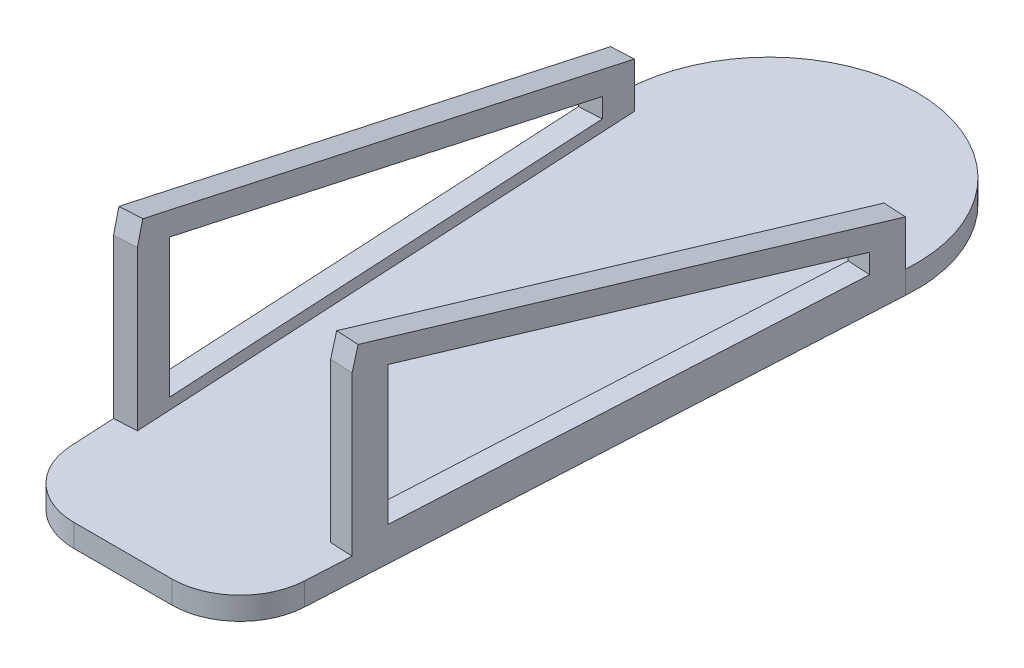
ISO-10303-21;
HEADER;
FILE_DESCRIPTION(('STEP AP214'),'2;1');
FILE_NAME('part.step','',(''),(''),'','','');
FILE_SCHEMA(('AUTOMOTIVE_DESIGN { 1 0 10303 214 1 1 1 1 }'));
ENDSEC;
DATA;
#1=APPLICATION_CONTEXT('core data for automotive mechanical design processes');
#2=APPLICATION_PROTOCOL_DEFINITION('international standard','automotive_design',2000,#1);
#3=PRODUCT_CONTEXT('',#1,'mechanical');
#4=PRODUCT('Part','Part','',(#3));
#5=PRODUCT_RELATED_PRODUCT_CATEGORY('part','',(#4));
#6=PRODUCT_DEFINITION_FORMATION('','',#4);
#7=PRODUCT_DEFINITION_CONTEXT('part definition',#1,'design');
#8=PRODUCT_DEFINITION('design','',#6,#7);
#9=PRODUCT_DEFINITION_SHAPE('','',#8);
#10=(LENGTH_UNIT() NAMED_UNIT(*) SI_UNIT(.MILLI.,.METRE.));
#11=(NAMED_UNIT(*) PLANE_ANGLE_UNIT() SI_UNIT($,.RADIAN.));
#12=(NAMED_UNIT(*) SI_UNIT($,.STERADIAN.) SOLID_ANGLE_UNIT());
#13=UNCERTAINTY_MEASURE_WITH_UNIT(LENGTH_MEASURE(1.E-05),#10,'distance_accuracy_value','');
#14=(GEOMETRIC_REPRESENTATION_CONTEXT(3) GLOBAL_UNCERTAINTY_ASSIGNED_CONTEXT((#13)) GLOBAL_UNIT_ASSIGNED_CONTEXT((#10,
#11,#12)) REPRESENTATION_CONTEXT('',''));
#15=CARTESIAN_POINT('',(0.,0.,0.));
#16=DIRECTION('',(0.,0.,1.));
#17=DIRECTION('',(1.,0.,0.));
#18=AXIS2_PLACEMENT_3D('',#15,#16,#17);
#19=CARTESIAN_POINT('',(0.,10.,-134.821428571429));
#20=DIRECTION('',(0.,-1.,0.));
#21=DIRECTION('',(0.,0.,-1.));
#22=AXIS2_PLACEMENT_3D('',#19,#20,#21);
#23=PLANE('',#22);
#24=DIRECTION('',(-0.998568132270089,0.,0.0534947213716119));
#25=VECTOR('',#24,1.);
#26=CARTESIAN_POINT('',(-42.6076802234846,10.,101.055637257489));
#27=LINE('',#26,#25);
#28=CARTESIAN_POINT('',(-42.6076802234846,10.,101.055637257489));
#29=VERTEX_POINT('',#28);
#30=CARTESIAN_POINT('',(-52.5933615461855,10.,101.590584471205));
#31=VERTEX_POINT('',#30);
#32=EDGE_CURVE('E251',#29,#31,#27,.T.);
#33=ORIENTED_EDGE('',*,*,#32,.T.);
#34=DIRECTION('',(0.0534947213716119,0.,0.998568132270089));
#35=VECTOR('',#34,1.);
#36=CARTESIAN_POINT('',(-65.,10.,-130.));
#37=LINE('',#36,#35);
#38=CARTESIAN_POINT('',(-51.5211691977956,10.,121.604841641148));
#39=VERTEX_POINT('',#38);
#40=EDGE_CURVE('E335',#31,#39,#37,.T.);
#41=ORIENTED_EDGE('',*,*,#40,.T.);
#42=CARTESIAN_POINT('',(-21.5641252296929,10.,120.));
#43=DIRECTION('',(0.,1.,0.));
#44=DIRECTION('',(0.,0.,1.));
#45=AXIS2_PLACEMENT_3D('',#42,#43,#44);
#46=CIRCLE('',#45,30.);
#47=CARTESIAN_POINT('',(-21.5641252296929,10.,150.));
#48=VERTEX_POINT('',#47);
#49=EDGE_CURVE('E338',#39,#48,#46,.T.);
#50=ORIENTED_EDGE('',*,*,#49,.T.);
#51=DIRECTION('',(1.,0.,0.));
#52=VECTOR('',#51,1.);
#53=CARTESIAN_POINT('',(-21.5641252296927,10.,150.));
#54=LINE('',#53,#52);
#55=CARTESIAN_POINT('',(21.5641252296928,10.,150.));
#56=VERTEX_POINT('',#55);
#57=EDGE_CURVE('E340',#48,#56,#54,.T.);
#58=ORIENTED_EDGE('',*,*,#57,.T.);
#59=CARTESIAN_POINT('',(21.564125229693,10.,120.));
#60=DIRECTION('',(0.,1.,0.));
#61=DIRECTION('',(0.,0.,1.));
#62=AXIS2_PLACEMENT_3D('',#59,#60,#61);
#63=CIRCLE('',#62,30.);
#64=CARTESIAN_POINT('',(51.5211691977957,10.,121.604841641148));
#65=VERTEX_POINT('',#64);
#66=EDGE_CURVE('E342',#56,#65,#63,.T.);
#67=ORIENTED_EDGE('',*,*,#66,.T.);
#68=DIRECTION('',(0.0534947213716119,0.,-0.998568132270089));
#69=VECTOR('',#68,1.);
#70=CARTESIAN_POINT('',(51.5211691977957,10.,121.604841641148));
#71=LINE('',#70,#69);
#72=CARTESIAN_POINT('',(52.5933615461855,10.,101.590584471205));
#73=VERTEX_POINT('',#72);
#74=EDGE_CURVE('E344',#65,#73,#71,.T.);
#75=ORIENTED_EDGE('',*,*,#74,.T.);
#76=DIRECTION('',(0.998568132270089,0.,0.0534947213716119));
#77=VECTOR('',#76,1.);
#78=CARTESIAN_POINT('',(42.6076802234846,10.,101.055637257489));
#79=LINE('',#78,#77);
#80=CARTESIAN_POINT('',(42.6076802234846,10.,101.055637257489));
#81=VERTEX_POINT('',#80);
#82=EDGE_CURVE('E311',#81,#73,#79,.T.);
#83=ORIENTED_EDGE('',*,*,#82,.F.);
#84=DIRECTION('',(0.0534947213716118,0.,-0.998568132270089));
#85=VECTOR('',#84,1.);
#86=CARTESIAN_POINT('',(55.0143186772991,10.,-130.534947213716));
#87=LINE('',#86,#85);
#88=CARTESIAN_POINT('',(55.0143186772991,10.,-130.534947213716));
#89=VERTEX_POINT('',#88);
#90=EDGE_CURVE('E298',#81,#89,#87,.T.);
#91=ORIENTED_EDGE('',*,*,#90,.T.);
#92=DIRECTION('',(0.998568132270089,0.,0.0534947213716119));
#93=VECTOR('',#92,1.);
#94=CARTESIAN_POINT('',(55.0143186772991,10.,-130.534947213716));
#95=LINE('',#94,#93);
#96=CARTESIAN_POINT('',(65.,10.,-130.));
#97=VERTEX_POINT('',#96);
#98=EDGE_CURVE('E329',#89,#97,#95,.T.);
#99=ORIENTED_EDGE('',*,*,#98,.T.);
#100=CARTESIAN_POINT('',(0.,10.,-134.821428571429));
#101=DIRECTION('',(0.,1.,0.));
#102=DIRECTION('',(0.,0.,-1.));
#103=AXIS2_PLACEMENT_3D('',#100,#101,#102);
#104=CIRCLE('',#103,65.1785714285714);
#105=CARTESIAN_POINT('',(-65.,10.,-130.));
#106=VERTEX_POINT('',#105);
#107=EDGE_CURVE('E333',#97,#106,#104,.T.);
#108=ORIENTED_EDGE('',*,*,#107,.T.);
#109=DIRECTION('',(-0.998568132270089,0.,0.0534947213716119));
#110=VECTOR('',#109,1.);
#111=CARTESIAN_POINT('',(-55.0143186772991,10.,-130.534947213716));
#112=LINE('',#111,#110);
#113=CARTESIAN_POINT('',(-55.0143186772991,10.,-130.534947213716));
#114=VERTEX_POINT('',#113);
#115=EDGE_CURVE('E56',#114,#106,#112,.T.);
#116=ORIENTED_EDGE('',*,*,#115,.F.);
#117=DIRECTION('',(-0.0534947213716118,0.,-0.998568132270089));
#118=VECTOR('',#117,1.);
#119=CARTESIAN_POINT('',(-55.0143186772991,10.,-130.534947213716));
#120=LINE('',#119,#118);
#121=EDGE_CURVE('E51',#29,#114,#120,.T.);
#122=ORIENTED_EDGE('',*,*,#121,.F.);
#123=EDGE_LOOP('',(#33,#41,#50,#58,#67,#75,#83,#91,#99,#108,#116,#122));
#124=FACE_BOUND('',#123,.T.);
#125=ADVANCED_FACE('F36',(#124),#23,.F.);
#126=CARTESIAN_POINT('',(0.,10.,-134.821428571429));
#127=DIRECTION('',(0.,-1.,0.));
#128=DIRECTION('',(0.,0.,-1.));
#129=AXIS2_PLACEMENT_3D('',#126,#127,#128);
#130=CYLINDRICAL_SURFACE('',#129,65.1785714285714);
#131=CARTESIAN_POINT('',(0.,0.,-134.821428571429));
#132=DIRECTION('',(0.,1.,0.));
#133=DIRECTION('',(0.,0.,-1.));
#134=AXIS2_PLACEMENT_3D('',#131,#132,#133);
#135=CIRCLE('',#134,65.1785714285714);
#136=CARTESIAN_POINT('',(65.,0.,-130.));
#137=VERTEX_POINT('',#136);
#138=CARTESIAN_POINT('',(-65.,0.,-130.));
#139=VERTEX_POINT('',#138);
#140=EDGE_CURVE('E324',#137,#139,#135,.T.);
#141=ORIENTED_EDGE('',*,*,#140,.T.);
#142=DIRECTION('',(0.,-1.,0.));
#143=VECTOR('',#142,1.);
#144=CARTESIAN_POINT('',(-65.,10.,-130.));
#145=LINE('',#144,#143);
#146=EDGE_CURVE('E11',#106,#139,#145,.T.);
#147=ORIENTED_EDGE('',*,*,#146,.F.);
#148=ORIENTED_EDGE('',*,*,#107,.F.);
#149=DIRECTION('',(0.,-1.,0.));
#150=VECTOR('',#149,1.);
#151=CARTESIAN_POINT('',(65.,10.,-130.));
#152=LINE('',#151,#150);
#153=EDGE_CURVE('E347',#97,#137,#152,.T.);
#154=ORIENTED_EDGE('',*,*,#153,.T.);
#155=EDGE_LOOP('',(#141,#147,#148,#154));
#156=FACE_BOUND('',#155,.T.);
#157=ADVANCED_FACE('F38',(#156),#130,.T.);
#158=CARTESIAN_POINT('',(-65.,10.,-130.));
#159=DIRECTION('',(0.998568132270089,0.,-0.0534947213716119));
#160=DIRECTION('',(-0.0534947213716119,0.,-0.998568132270089));
#161=AXIS2_PLACEMENT_3D('',#158,#159,#160);
#162=PLANE('',#161);
#163=DIRECTION('',(0.0534947213716119,0.,0.998568132270089));
#164=VECTOR('',#163,1.);
#165=CARTESIAN_POINT('',(-65.,0.,-130.));
#166=LINE('',#165,#164);
#167=CARTESIAN_POINT('',(-51.5211691977956,0.,121.604841641148));
#168=VERTEX_POINT('',#167);
#169=EDGE_CURVE('E350',#139,#168,#166,.T.);
#170=ORIENTED_EDGE('',*,*,#169,.T.);
#171=DIRECTION('',(0.,-1.,0.));
#172=VECTOR('',#171,1.);
#173=CARTESIAN_POINT('',(-51.5211691977956,10.,121.604841641148));
#174=LINE('',#173,#172);
#175=EDGE_CURVE('E44',#39,#168,#174,.T.);
#176=ORIENTED_EDGE('',*,*,#175,.F.);
#177=ORIENTED_EDGE('',*,*,#40,.F.);
#178=DIRECTION('',(0.,-1.,0.));
#179=VECTOR('',#178,1.);
#180=CARTESIAN_POINT('',(-52.5933615461855,10.,101.590584471205));
#181=LINE('',#180,#179);
#182=CARTESIAN_POINT('',(-52.5933615461855,80.,101.590584471205));
#183=VERTEX_POINT('',#182);
#184=EDGE_CURVE('E229',#183,#31,#181,.T.);
#185=ORIENTED_EDGE('',*,*,#184,.F.);
#186=DIRECTION('',(0.0134679695925024,-0.967789025760913,0.251402099060048));
#187=VECTOR('',#186,1.);
#188=CARTESIAN_POINT('',(-52.5933615461855,80.,101.590584471205));
#189=LINE('',#188,#187);
#190=CARTESIAN_POINT('',(-52.7280412421105,89.6778902576091,99.0765634806047));
#191=VERTEX_POINT('',#190);
#192=EDGE_CURVE('E246',#191,#183,#189,.T.);
#193=ORIENTED_EDGE('',*,*,#192,.F.);
#194=DIRECTION('',(0.0517716042795837,0.251762589787965,0.966403279885564));
#195=VECTOR('',#194,1.);
#196=CARTESIAN_POINT('',(-52.7280412421105,89.6778902576091,99.0765634806047));
#197=LINE('',#196,#195);
#198=CARTESIAN_POINT('',(-65.,30.,-130.));
#199=VERTEX_POINT('',#198);
#200=EDGE_CURVE('E248',#199,#191,#197,.T.);
#201=ORIENTED_EDGE('',*,*,#200,.F.);
#202=DIRECTION('',(0.,1.,0.));
#203=VECTOR('',#202,1.);
#204=CARTESIAN_POINT('',(-65.,30.,-130.));
#205=LINE('',#204,#203);
#206=EDGE_CURVE('E236',#106,#199,#205,.T.);
#207=ORIENTED_EDGE('',*,*,#206,.F.);
#208=ORIENTED_EDGE('',*,*,#146,.T.);
#209=EDGE_LOOP('',(#170,#176,#177,#185,#193,#201,#207,#208));
#210=FACE_BOUND('',#209,.T.);
#211=DIRECTION('',(0.0517716042795837,0.251762589787965,0.966403279885564));
#212=VECTOR('',#211,1.);
#213=CARTESIAN_POINT('',(-53.3957823667597,76.0978697357616,86.6120624871538));
#214=LINE('',#213,#212);
#215=CARTESIAN_POINT('',(-64.1975791794259,23.5692997259528,-115.021478015949));
#216=VERTEX_POINT('',#215);
#217=CARTESIAN_POINT('',(-53.3957823667597,76.0978697357616,86.6120624871538));
#218=VERTEX_POINT('',#217);
#219=EDGE_CURVE('E223',#216,#218,#214,.T.);
#220=ORIENTED_EDGE('',*,*,#219,.T.);
#221=DIRECTION('',(0.,-1.,0.));
#222=VECTOR('',#221,1.);
#223=CARTESIAN_POINT('',(-53.3957823667597,15.,86.6120624871538));
#224=LINE('',#223,#222);
#225=CARTESIAN_POINT('',(-53.3957823667597,15.,86.6120624871538));
#226=VERTEX_POINT('',#225);
#227=EDGE_CURVE('E209',#218,#226,#224,.T.);
#228=ORIENTED_EDGE('',*,*,#227,.T.);
#229=DIRECTION('',(-0.0534947213716119,0.,-0.998568132270089));
#230=VECTOR('',#229,1.);
#231=CARTESIAN_POINT('',(-64.1975791794259,15.,-115.021478015949));
#232=LINE('',#231,#230);
#233=CARTESIAN_POINT('',(-64.1975791794259,15.,-115.021478015949));
#234=VERTEX_POINT('',#233);
#235=EDGE_CURVE('E214',#226,#234,#232,.T.);
#236=ORIENTED_EDGE('',*,*,#235,.T.);
#237=DIRECTION('',(0.,1.,0.));
#238=VECTOR('',#237,1.);
#239=CARTESIAN_POINT('',(-64.1975791794259,23.5692997259528,-115.021478015949));
#240=LINE('',#239,#238);
#241=EDGE_CURVE('E217',#234,#216,#240,.T.);
#242=ORIENTED_EDGE('',*,*,#241,.T.);
#243=EDGE_LOOP('',(#220,#228,#236,#242));
#244=FACE_BOUND('',#243,.T.);
#245=ADVANCED_FACE('F395',(#210,#244),#162,.F.);
#246=CARTESIAN_POINT('',(-21.5641252296929,10.,120.));
#247=DIRECTION('',(0.,-1.,0.));
#248=DIRECTION('',(0.,0.,-1.));
#249=AXIS2_PLACEMENT_3D('',#246,#247,#248);
#250=CYLINDRICAL_SURFACE('',#249,30.);
#251=CARTESIAN_POINT('',(-21.5641252296929,0.,120.));
#252=DIRECTION('',(0.,1.,0.));
#253=DIRECTION('',(0.,0.,1.));
#254=AXIS2_PLACEMENT_3D('',#251,#252,#253);
#255=CIRCLE('',#254,30.);
#256=CARTESIAN_POINT('',(-21.5641252296929,0.,150.));
#257=VERTEX_POINT('',#256);
#258=EDGE_CURVE('E352',#168,#257,#255,.T.);
#259=ORIENTED_EDGE('',*,*,#258,.T.);
#260=DIRECTION('',(0.,-1.,0.));
#261=VECTOR('',#260,1.);
#262=CARTESIAN_POINT('',(-21.5641252296929,10.,150.));
#263=LINE('',#262,#261);
#264=EDGE_CURVE('E367',#48,#257,#263,.T.);
#265=ORIENTED_EDGE('',*,*,#264,.F.);
#266=ORIENTED_EDGE('',*,*,#49,.F.);
#267=ORIENTED_EDGE('',*,*,#175,.T.);
#268=EDGE_LOOP('',(#259,#265,#266,#267));
#269=FACE_BOUND('',#268,.T.);
#270=ADVANCED_FACE('F374',(#269),#250,.T.);
#271=CARTESIAN_POINT('',(-21.5641252296927,10.,150.));
#272=DIRECTION('',(0.,0.,-1.));
#273=DIRECTION('',(-1.,0.,0.));
#274=AXIS2_PLACEMENT_3D('',#271,#272,#273);
#275=PLANE('',#274);
#276=DIRECTION('',(1.,0.,0.));
#277=VECTOR('',#276,1.);
#278=CARTESIAN_POINT('',(-21.5641252296927,0.,150.));
#279=LINE('',#278,#277);
#280=CARTESIAN_POINT('',(21.5641252296928,0.,150.));
#281=VERTEX_POINT('',#280);
#282=EDGE_CURVE('E354',#257,#281,#279,.T.);
#283=ORIENTED_EDGE('',*,*,#282,.T.);
#284=DIRECTION('',(0.,-1.,0.));
#285=VECTOR('',#284,1.);
#286=CARTESIAN_POINT('',(21.5641252296928,10.,150.));
#287=LINE('',#286,#285);
#288=EDGE_CURVE('E364',#56,#281,#287,.T.);
#289=ORIENTED_EDGE('',*,*,#288,.F.);
#290=ORIENTED_EDGE('',*,*,#57,.F.);
#291=ORIENTED_EDGE('',*,*,#264,.T.);
#292=EDGE_LOOP('',(#283,#289,#290,#291));
#293=FACE_BOUND('',#292,.T.);
#294=ADVANCED_FACE('F385',(#293),#275,.F.);
#295=CARTESIAN_POINT('',(21.564125229693,10.,120.));
#296=DIRECTION('',(0.,-1.,0.));
#297=DIRECTION('',(0.,0.,-1.));
#298=AXIS2_PLACEMENT_3D('',#295,#296,#297);
#299=CYLINDRICAL_SURFACE('',#298,30.);
#300=CARTESIAN_POINT('',(21.564125229693,0.,120.));
#301=DIRECTION('',(0.,1.,0.));
#302=DIRECTION('',(0.,0.,1.));
#303=AXIS2_PLACEMENT_3D('',#300,#301,#302);
#304=CIRCLE('',#303,30.);
#305=CARTESIAN_POINT('',(51.5211691977957,0.,121.604841641148));
#306=VERTEX_POINT('',#305);
#307=EDGE_CURVE('E356',#281,#306,#304,.T.);
#308=ORIENTED_EDGE('',*,*,#307,.T.);
#309=DIRECTION('',(0.,-1.,0.));
#310=VECTOR('',#309,1.);
#311=CARTESIAN_POINT('',(51.5211691977957,10.,121.604841641148));
#312=LINE('',#311,#310);
#313=EDGE_CURVE('E361',#65,#306,#312,.T.);
#314=ORIENTED_EDGE('',*,*,#313,.F.);
#315=ORIENTED_EDGE('',*,*,#66,.F.);
#316=ORIENTED_EDGE('',*,*,#288,.T.);
#317=EDGE_LOOP('',(#308,#314,#315,#316));
#318=FACE_BOUND('',#317,.T.);
#319=ADVANCED_FACE('F389',(#318),#299,.T.);
#320=CARTESIAN_POINT('',(51.5211691977957,10.,121.604841641148));
#321=DIRECTION('',(-0.998568132270089,0.,-0.0534947213716119));
#322=DIRECTION('',(-0.0534947213716119,0.,0.998568132270089));
#323=AXIS2_PLACEMENT_3D('',#320,#321,#322);
#324=PLANE('',#323);
#325=DIRECTION('',(0.0534947213716119,0.,-0.998568132270089));
#326=VECTOR('',#325,1.);
#327=CARTESIAN_POINT('',(51.5211691977957,0.,121.604841641148));
#328=LINE('',#327,#326);
#329=EDGE_CURVE('E336',#306,#137,#328,.T.);
#330=ORIENTED_EDGE('',*,*,#329,.T.);
#331=ORIENTED_EDGE('',*,*,#153,.F.);
#332=DIRECTION('',(0.,1.,0.));
#333=VECTOR('',#332,1.);
#334=CARTESIAN_POINT('',(65.,30.,-130.));
#335=LINE('',#334,#333);
#336=CARTESIAN_POINT('',(65.,30.,-130.));
#337=VERTEX_POINT('',#336);
#338=EDGE_CURVE('E314',#97,#337,#335,.T.);
#339=ORIENTED_EDGE('',*,*,#338,.T.);
#340=DIRECTION('',(-0.0517716042795837,0.251762589787965,0.966403279885564));
#341=VECTOR('',#340,1.);
#342=CARTESIAN_POINT('',(52.7280412421105,89.6778902576091,99.0765634806047));
#343=LINE('',#342,#341);
#344=CARTESIAN_POINT('',(52.7280412421105,89.6778902576091,99.0765634806047));
#345=VERTEX_POINT('',#344);
#346=EDGE_CURVE('E317',#337,#345,#343,.T.);
#347=ORIENTED_EDGE('',*,*,#346,.T.);
#348=DIRECTION('',(-0.0134679695925024,-0.967789025760913,0.251402099060048));
#349=VECTOR('',#348,1.);
#350=CARTESIAN_POINT('',(52.5933615461855,80.,101.590584471205));
#351=LINE('',#350,#349);
#352=CARTESIAN_POINT('',(52.5933615461855,80.,101.590584471205));
#353=VERTEX_POINT('',#352);
#354=EDGE_CURVE('E299',#345,#353,#351,.T.);
#355=ORIENTED_EDGE('',*,*,#354,.T.);
#356=DIRECTION('',(0.,-1.,0.));
#357=VECTOR('',#356,1.);
#358=CARTESIAN_POINT('',(52.5933615461855,10.,101.590584471205));
#359=LINE('',#358,#357);
#360=EDGE_CURVE('E288',#353,#73,#359,.T.);
#361=ORIENTED_EDGE('',*,*,#360,.T.);
#362=ORIENTED_EDGE('',*,*,#74,.F.);
#363=ORIENTED_EDGE('',*,*,#313,.T.);
#364=EDGE_LOOP('',(#330,#331,#339,#347,#355,#361,#362,#363));
#365=FACE_BOUND('',#364,.T.);
#366=DIRECTION('',(0.,-1.,0.));
#367=VECTOR('',#366,1.);
#368=CARTESIAN_POINT('',(53.3957823667597,15.,86.6120624871538));
#369=LINE('',#368,#367);
#370=CARTESIAN_POINT('',(53.3957823667597,76.0978697357616,86.6120624871538));
#371=VERTEX_POINT('',#370);
#372=CARTESIAN_POINT('',(53.3957823667597,15.,86.6120624871538));
#373=VERTEX_POINT('',#372);
#374=EDGE_CURVE('E253',#371,#373,#369,.T.);
#375=ORIENTED_EDGE('',*,*,#374,.F.);
#376=DIRECTION('',(-0.0517716042795837,0.251762589787965,0.966403279885564));
#377=VECTOR('',#376,1.);
#378=CARTESIAN_POINT('',(53.3957823667597,76.0978697357616,86.6120624871538));
#379=LINE('',#378,#377);
#380=CARTESIAN_POINT('',(64.1975791794259,23.5692997259528,-115.021478015949));
#381=VERTEX_POINT('',#380);
#382=EDGE_CURVE('E267',#381,#371,#379,.T.);
#383=ORIENTED_EDGE('',*,*,#382,.F.);
#384=DIRECTION('',(0.,1.,0.));
#385=VECTOR('',#384,1.);
#386=CARTESIAN_POINT('',(64.1975791794259,23.5692997259528,-115.021478015949));
#387=LINE('',#386,#385);
#388=CARTESIAN_POINT('',(64.1975791794259,15.,-115.021478015949));
#389=VERTEX_POINT('',#388);
#390=EDGE_CURVE('E281',#389,#381,#387,.T.);
#391=ORIENTED_EDGE('',*,*,#390,.F.);
#392=DIRECTION('',(0.0534947213716119,0.,-0.998568132270089));
#393=VECTOR('',#392,1.);
#394=CARTESIAN_POINT('',(64.1975791794259,15.,-115.021478015949));
#395=LINE('',#394,#393);
#396=EDGE_CURVE('E278',#373,#389,#395,.T.);
#397=ORIENTED_EDGE('',*,*,#396,.F.);
#398=EDGE_LOOP('',(#375,#383,#391,#397));
#399=FACE_BOUND('',#398,.T.);
#400=ADVANCED_FACE('F442',(#365,#399),#324,.F.);
#401=CARTESIAN_POINT('',(0.,0.,-134.821428571429));
#402=DIRECTION('',(0.,-1.,0.));
#403=DIRECTION('',(0.,0.,-1.));
#404=AXIS2_PLACEMENT_3D('',#401,#402,#403);
#405=PLANE('',#404);
#406=ORIENTED_EDGE('',*,*,#140,.F.);
#407=ORIENTED_EDGE('',*,*,#329,.F.);
#408=ORIENTED_EDGE('',*,*,#307,.F.);
#409=ORIENTED_EDGE('',*,*,#282,.F.);
#410=ORIENTED_EDGE('',*,*,#258,.F.);
#411=ORIENTED_EDGE('',*,*,#169,.F.);
#412=EDGE_LOOP('',(#406,#407,#408,#409,#410,#411));
#413=FACE_BOUND('',#412,.T.);
#414=ADVANCED_FACE('F380',(#413),#405,.T.);
#415=CARTESIAN_POINT('',(42.6076802234846,10.,101.055637257489));
#416=DIRECTION('',(-0.0534947213716119,0.,0.998568132270089));
#417=DIRECTION('',(0.998568132270089,0.,0.0534947213716119));
#418=AXIS2_PLACEMENT_3D('',#415,#416,#417);
#419=PLANE('',#418);
#420=ORIENTED_EDGE('',*,*,#360,.F.);
#421=DIRECTION('',(0.998568132270089,0.,0.0534947213716119));
#422=VECTOR('',#421,1.);
#423=CARTESIAN_POINT('',(42.6076802234846,80.,101.055637257489));
#424=LINE('',#423,#422);
#425=CARTESIAN_POINT('',(42.6076802234846,80.,101.055637257489));
#426=VERTEX_POINT('',#425);
#427=EDGE_CURVE('E322',#426,#353,#424,.T.);
#428=ORIENTED_EDGE('',*,*,#427,.F.);
#429=DIRECTION('',(0.,-1.,0.));
#430=VECTOR('',#429,1.);
#431=CARTESIAN_POINT('',(42.6076802234846,10.,101.055637257489));
#432=LINE('',#431,#430);
#433=EDGE_CURVE('E295',#426,#81,#432,.T.);
#434=ORIENTED_EDGE('',*,*,#433,.T.);
#435=ORIENTED_EDGE('',*,*,#82,.T.);
#436=EDGE_LOOP('',(#420,#428,#434,#435));
#437=FACE_BOUND('',#436,.T.);
#438=ADVANCED_FACE('F438',(#437),#419,.T.);
#439=CARTESIAN_POINT('',(42.6076802234846,80.,101.055637257489));
#440=DIRECTION('',(-0.0517716042795838,0.251762589787964,0.966403279885564));
#441=DIRECTION('',(0.,-0.967701014082807,0.252100669065171));
#442=AXIS2_PLACEMENT_3D('',#439,#440,#441);
#443=PLANE('',#442);
#444=ORIENTED_EDGE('',*,*,#354,.F.);
#445=DIRECTION('',(0.998568132270089,0.,0.0534947213716119));
#446=VECTOR('',#445,1.);
#447=CARTESIAN_POINT('',(42.7423599194096,89.6778902576091,98.5416162668886));
#448=LINE('',#447,#446);
#449=CARTESIAN_POINT('',(42.7423599194096,89.6778902576091,98.5416162668886));
#450=VERTEX_POINT('',#449);
#451=EDGE_CURVE('E325',#450,#345,#448,.T.);
#452=ORIENTED_EDGE('',*,*,#451,.F.);
#453=DIRECTION('',(-0.0134679695925024,-0.967789025760913,0.251402099060048));
#454=VECTOR('',#453,1.);
#455=CARTESIAN_POINT('',(42.6076802234846,80.,101.055637257489));
#456=LINE('',#455,#454);
#457=EDGE_CURVE('E308',#450,#426,#456,.T.);
#458=ORIENTED_EDGE('',*,*,#457,.T.);
#459=ORIENTED_EDGE('',*,*,#427,.T.);
#460=EDGE_LOOP('',(#444,#452,#458,#459));
#461=FACE_BOUND('',#460,.T.);
#462=ADVANCED_FACE('F482',(#461),#443,.T.);
#463=CARTESIAN_POINT('',(42.7423599194096,89.6778902576091,98.5416162668886));
#464=DIRECTION('',(0.0134679695925026,0.967789025760913,-0.251402099060049));
#465=DIRECTION('',(0.,0.251424902598613,0.967876809492447));
#466=AXIS2_PLACEMENT_3D('',#463,#464,#465);
#467=PLANE('',#466);
#468=ORIENTED_EDGE('',*,*,#346,.F.);
#469=DIRECTION('',(0.998568132270089,0.,0.0534947213716119));
#470=VECTOR('',#469,1.);
#471=CARTESIAN_POINT('',(55.0143186772991,30.,-130.534947213716));
#472=LINE('',#471,#470);
#473=CARTESIAN_POINT('',(55.0143186772991,30.,-130.534947213716));
#474=VERTEX_POINT('',#473);
#475=EDGE_CURVE('E327',#474,#337,#472,.T.);
#476=ORIENTED_EDGE('',*,*,#475,.F.);
#477=DIRECTION('',(-0.0517716042795837,0.251762589787965,0.966403279885564));
#478=VECTOR('',#477,1.);
#479=CARTESIAN_POINT('',(42.7423599194096,89.6778902576091,98.5416162668886));
#480=LINE('',#479,#478);
#481=EDGE_CURVE('E305',#474,#450,#480,.T.);
#482=ORIENTED_EDGE('',*,*,#481,.T.);
#483=ORIENTED_EDGE('',*,*,#451,.T.);
#484=EDGE_LOOP('',(#468,#476,#482,#483));
#485=FACE_BOUND('',#484,.T.);
#486=ADVANCED_FACE('F489',(#485),#467,.T.);
#487=CARTESIAN_POINT('',(55.0143186772991,30.,-130.534947213716));
#488=DIRECTION('',(0.0534947213716119,0.,-0.998568132270089));
#489=DIRECTION('',(-0.998568132270089,0.,-0.0534947213716119));
#490=AXIS2_PLACEMENT_3D('',#487,#488,#489);
#491=PLANE('',#490);
#492=ORIENTED_EDGE('',*,*,#338,.F.);
#493=ORIENTED_EDGE('',*,*,#98,.F.);
#494=DIRECTION('',(0.,1.,0.));
#495=VECTOR('',#494,1.);
#496=CARTESIAN_POINT('',(55.0143186772991,30.,-130.534947213716));
#497=LINE('',#496,#495);
#498=EDGE_CURVE('E302',#89,#474,#497,.T.);
#499=ORIENTED_EDGE('',*,*,#498,.T.);
#500=ORIENTED_EDGE('',*,*,#475,.T.);
#501=EDGE_LOOP('',(#492,#493,#499,#500));
#502=FACE_BOUND('',#501,.T.);
#503=ADVANCED_FACE('F497',(#502),#491,.T.);
#504=CARTESIAN_POINT('',(47.8839530175217,0.,2.5652117687958));
#505=DIRECTION('',(0.998568132270089,0.,0.0534947213716119));
#506=DIRECTION('',(0.0534947213716118,0.,-0.998568132270089));
#507=AXIS2_PLACEMENT_3D('',#504,#505,#506);
#508=PLANE('',#507);
#509=DIRECTION('',(-0.0517716042795837,0.251762589787965,0.966403279885564));
#510=VECTOR('',#509,1.);
#511=CARTESIAN_POINT('',(43.4101010440588,76.0978697357616,86.0771152734377));
#512=LINE('',#511,#510);
#513=CARTESIAN_POINT('',(54.211897856725,23.5692997259528,-115.556425229665));
#514=VERTEX_POINT('',#513);
#515=CARTESIAN_POINT('',(43.4101010440588,76.0978697357616,86.0771152734377));
#516=VERTEX_POINT('',#515);
#517=EDGE_CURVE('E273',#514,#516,#512,.T.);
#518=ORIENTED_EDGE('',*,*,#517,.T.);
#519=DIRECTION('',(0.,-1.,0.));
#520=VECTOR('',#519,1.);
#521=CARTESIAN_POINT('',(43.4101010440588,15.,86.0771152734377));
#522=LINE('',#521,#520);
#523=CARTESIAN_POINT('',(43.4101010440588,15.,86.0771152734377));
#524=VERTEX_POINT('',#523);
#525=EDGE_CURVE('E263',#516,#524,#522,.T.);
#526=ORIENTED_EDGE('',*,*,#525,.T.);
#527=DIRECTION('',(0.0534947213716119,0.,-0.998568132270089));
#528=VECTOR('',#527,1.);
#529=CARTESIAN_POINT('',(54.211897856725,15.,-115.556425229665));
#530=LINE('',#529,#528);
#531=CARTESIAN_POINT('',(54.211897856725,15.,-115.556425229665));
#532=VERTEX_POINT('',#531);
#533=EDGE_CURVE('E266',#524,#532,#530,.T.);
#534=ORIENTED_EDGE('',*,*,#533,.T.);
#535=DIRECTION('',(0.,1.,0.));
#536=VECTOR('',#535,1.);
#537=CARTESIAN_POINT('',(54.211897856725,23.5692997259528,-115.556425229665));
#538=LINE('',#537,#536);
#539=EDGE_CURVE('E270',#532,#514,#538,.T.);
#540=ORIENTED_EDGE('',*,*,#539,.T.);
#541=EDGE_LOOP('',(#518,#526,#534,#540));
#542=FACE_BOUND('',#541,.T.);
#543=ORIENTED_EDGE('',*,*,#433,.F.);
#544=ORIENTED_EDGE('',*,*,#457,.F.);
#545=ORIENTED_EDGE('',*,*,#481,.F.);
#546=ORIENTED_EDGE('',*,*,#498,.F.);
#547=ORIENTED_EDGE('',*,*,#90,.F.);
#548=EDGE_LOOP('',(#543,#544,#545,#546,#547));
#549=FACE_BOUND('',#548,.T.);
#550=ADVANCED_FACE('F505',(#542,#549),#508,.F.);
#551=CARTESIAN_POINT('',(43.4101010440588,15.,86.0771152734377));
#552=DIRECTION('',(-0.0534947213716119,0.,0.998568132270089));
#553=DIRECTION('',(0.998568132270089,0.,0.0534947213716119));
#554=AXIS2_PLACEMENT_3D('',#551,#552,#553);
#555=PLANE('',#554);
#556=ORIENTED_EDGE('',*,*,#374,.T.);
#557=DIRECTION('',(0.998568132270089,0.,0.0534947213716119));
#558=VECTOR('',#557,1.);
#559=CARTESIAN_POINT('',(43.4101010440588,15.,86.0771152734377));
#560=LINE('',#559,#558);
#561=EDGE_CURVE('E276',#524,#373,#560,.T.);
#562=ORIENTED_EDGE('',*,*,#561,.F.);
#563=ORIENTED_EDGE('',*,*,#525,.F.);
#564=DIRECTION('',(0.998568132270089,0.,0.0534947213716119));
#565=VECTOR('',#564,1.);
#566=CARTESIAN_POINT('',(43.4101010440588,76.0978697357616,86.0771152734377));
#567=LINE('',#566,#565);
#568=EDGE_CURVE('E286',#516,#371,#567,.T.);
#569=ORIENTED_EDGE('',*,*,#568,.T.);
#570=EDGE_LOOP('',(#556,#562,#563,#569));
#571=FACE_BOUND('',#570,.T.);
#572=ADVANCED_FACE('F512',(#571),#555,.F.);
#573=CARTESIAN_POINT('',(43.4101010440588,76.0978697357616,86.0771152734377));
#574=DIRECTION('',(0.0134679695925026,0.967789025760913,-0.251402099060049));
#575=DIRECTION('',(0.,0.251424902598613,0.967876809492447));
#576=AXIS2_PLACEMENT_3D('',#573,#574,#575);
#577=PLANE('',#576);
#578=ORIENTED_EDGE('',*,*,#382,.T.);
#579=ORIENTED_EDGE('',*,*,#568,.F.);
#580=ORIENTED_EDGE('',*,*,#517,.F.);
#581=DIRECTION('',(0.998568132270089,0.,0.0534947213716119));
#582=VECTOR('',#581,1.);
#583=CARTESIAN_POINT('',(54.211897856725,23.5692997259528,-115.556425229665));
#584=LINE('',#583,#582);
#585=EDGE_CURVE('E289',#514,#381,#584,.T.);
#586=ORIENTED_EDGE('',*,*,#585,.T.);
#587=EDGE_LOOP('',(#578,#579,#580,#586));
#588=FACE_BOUND('',#587,.T.);
#589=ADVANCED_FACE('F520',(#588),#577,.F.);
#590=CARTESIAN_POINT('',(54.211897856725,23.5692997259528,-115.556425229665));
#591=DIRECTION('',(0.0534947213716119,0.,-0.998568132270089));
#592=DIRECTION('',(-0.998568132270089,0.,-0.0534947213716119));
#593=AXIS2_PLACEMENT_3D('',#590,#591,#592);
#594=PLANE('',#593);
#595=ORIENTED_EDGE('',*,*,#390,.T.);
#596=ORIENTED_EDGE('',*,*,#585,.F.);
#597=ORIENTED_EDGE('',*,*,#539,.F.);
#598=DIRECTION('',(0.998568132270089,0.,0.0534947213716119));
#599=VECTOR('',#598,1.);
#600=CARTESIAN_POINT('',(54.211897856725,15.,-115.556425229665));
#601=LINE('',#600,#599);
#602=EDGE_CURVE('E291',#532,#389,#601,.T.);
#603=ORIENTED_EDGE('',*,*,#602,.T.);
#604=EDGE_LOOP('',(#595,#596,#597,#603));
#605=FACE_BOUND('',#604,.T.);
#606=ADVANCED_FACE('F425',(#605),#594,.F.);
#607=CARTESIAN_POINT('',(54.211897856725,15.,-115.556425229665));
#608=DIRECTION('',(0.,-1.,0.));
#609=DIRECTION('',(0.,0.,-1.));
#610=AXIS2_PLACEMENT_3D('',#607,#608,#609);
#611=PLANE('',#610);
#612=ORIENTED_EDGE('',*,*,#396,.T.);
#613=ORIENTED_EDGE('',*,*,#602,.F.);
#614=ORIENTED_EDGE('',*,*,#533,.F.);
#615=ORIENTED_EDGE('',*,*,#561,.T.);
#616=EDGE_LOOP('',(#612,#613,#614,#615));
#617=FACE_BOUND('',#616,.T.);
#618=ADVANCED_FACE('F418',(#617),#611,.F.);
#619=CARTESIAN_POINT('',(-47.8839530175217,0.,2.5652117687958));
#620=DIRECTION('',(-0.998568132270089,0.,0.0534947213716119));
#621=DIRECTION('',(-0.0534947213716118,0.,-0.998568132270089));
#622=AXIS2_PLACEMENT_3D('',#619,#620,#621);
#623=PLANE('',#622);
#624=DIRECTION('',(0.,-1.,0.));
#625=VECTOR('',#624,1.);
#626=CARTESIAN_POINT('',(-42.6076802234846,10.,101.055637257489));
#627=LINE('',#626,#625);
#628=CARTESIAN_POINT('',(-42.6076802234846,80.,101.055637257489));
#629=VERTEX_POINT('',#628);
#630=EDGE_CURVE('E233',#629,#29,#627,.T.);
#631=ORIENTED_EDGE('',*,*,#630,.T.);
#632=ORIENTED_EDGE('',*,*,#121,.T.);
#633=DIRECTION('',(0.,1.,0.));
#634=VECTOR('',#633,1.);
#635=CARTESIAN_POINT('',(-55.0143186772991,30.,-130.534947213716));
#636=LINE('',#635,#634);
#637=CARTESIAN_POINT('',(-55.0143186772991,30.,-130.534947213716));
#638=VERTEX_POINT('',#637);
#639=EDGE_CURVE('E240',#114,#638,#636,.T.);
#640=ORIENTED_EDGE('',*,*,#639,.T.);
#641=DIRECTION('',(0.0517716042795837,0.251762589787965,0.966403279885564));
#642=VECTOR('',#641,1.);
#643=CARTESIAN_POINT('',(-42.7423599194096,89.6778902576091,98.5416162668886));
#644=LINE('',#643,#642);
#645=CARTESIAN_POINT('',(-42.7423599194096,89.6778902576091,98.5416162668886));
#646=VERTEX_POINT('',#645);
#647=EDGE_CURVE('E238',#638,#646,#644,.T.);
#648=ORIENTED_EDGE('',*,*,#647,.T.);
#649=DIRECTION('',(0.0134679695925024,-0.967789025760913,0.251402099060048));
#650=VECTOR('',#649,1.);
#651=CARTESIAN_POINT('',(-42.6076802234846,80.,101.055637257489));
#652=LINE('',#651,#650);
#653=EDGE_CURVE('E235',#646,#629,#652,.T.);
#654=ORIENTED_EDGE('',*,*,#653,.T.);
#655=EDGE_LOOP('',(#631,#632,#640,#648,#654));
#656=FACE_BOUND('',#655,.T.);
#657=DIRECTION('',(0.,-1.,0.));
#658=VECTOR('',#657,1.);
#659=CARTESIAN_POINT('',(-43.4101010440588,15.,86.0771152734377));
#660=LINE('',#659,#658);
#661=CARTESIAN_POINT('',(-43.4101010440588,76.0978697357616,86.0771152734377));
#662=VERTEX_POINT('',#661);
#663=CARTESIAN_POINT('',(-43.4101010440588,15.,86.0771152734377));
#664=VERTEX_POINT('',#663);
#665=EDGE_CURVE('E202',#662,#664,#660,.T.);
#666=ORIENTED_EDGE('',*,*,#665,.F.);
#667=DIRECTION('',(0.0517716042795837,0.251762589787965,0.966403279885564));
#668=VECTOR('',#667,1.);
#669=CARTESIAN_POINT('',(-43.4101010440588,76.0978697357616,86.0771152734377));
#670=LINE('',#669,#668);
#671=CARTESIAN_POINT('',(-54.211897856725,23.5692997259528,-115.556425229665));
#672=VERTEX_POINT('',#671);
#673=EDGE_CURVE('E190',#672,#662,#670,.T.);
#674=ORIENTED_EDGE('',*,*,#673,.F.);
#675=DIRECTION('',(0.,1.,0.));
#676=VECTOR('',#675,1.);
#677=CARTESIAN_POINT('',(-54.211897856725,23.5692997259528,-115.556425229665));
#678=LINE('',#677,#676);
#679=CARTESIAN_POINT('',(-54.211897856725,15.,-115.556425229665));
#680=VERTEX_POINT('',#679);
#681=EDGE_CURVE('E201',#680,#672,#678,.T.);
#682=ORIENTED_EDGE('',*,*,#681,.F.);
#683=DIRECTION('',(-0.0534947213716119,0.,-0.998568132270089));
#684=VECTOR('',#683,1.);
#685=CARTESIAN_POINT('',(-54.211897856725,15.,-115.556425229665));
#686=LINE('',#685,#684);
#687=EDGE_CURVE('E210',#664,#680,#686,.T.);
#688=ORIENTED_EDGE('',*,*,#687,.F.);
#689=EDGE_LOOP('',(#666,#674,#682,#688));
#690=FACE_BOUND('',#689,.T.);
#691=ADVANCED_FACE('F213',(#656,#690),#623,.F.);
#692=CARTESIAN_POINT('',(-42.6076802234846,10.,101.055637257489));
#693=DIRECTION('',(-0.0534947213716119,0.,-0.998568132270089));
#694=DIRECTION('',(-0.998568132270089,0.,0.0534947213716119));
#695=AXIS2_PLACEMENT_3D('',#692,#693,#694);
#696=PLANE('',#695);
#697=ORIENTED_EDGE('',*,*,#184,.T.);
#698=ORIENTED_EDGE('',*,*,#32,.F.);
#699=ORIENTED_EDGE('',*,*,#630,.F.);
#700=DIRECTION('',(-0.998568132270089,0.,0.0534947213716119));
#701=VECTOR('',#700,1.);
#702=CARTESIAN_POINT('',(-42.6076802234846,80.,101.055637257489));
#703=LINE('',#702,#701);
#704=EDGE_CURVE('E243',#629,#183,#703,.T.);
#705=ORIENTED_EDGE('',*,*,#704,.T.);
#706=EDGE_LOOP('',(#697,#698,#699,#705));
#707=FACE_BOUND('',#706,.T.);
#708=ADVANCED_FACE('F400',(#707),#696,.F.);
#709=CARTESIAN_POINT('',(-55.0143186772991,30.,-130.534947213716));
#710=DIRECTION('',(0.0534947213716119,0.,0.998568132270089));
#711=DIRECTION('',(0.998568132270089,0.,-0.0534947213716119));
#712=AXIS2_PLACEMENT_3D('',#709,#710,#711);
#713=PLANE('',#712);
#714=ORIENTED_EDGE('',*,*,#206,.T.);
#715=DIRECTION('',(-0.998568132270089,0.,0.0534947213716119));
#716=VECTOR('',#715,1.);
#717=CARTESIAN_POINT('',(-55.0143186772991,30.,-130.534947213716));
#718=LINE('',#717,#716);
#719=EDGE_CURVE('E255',#638,#199,#718,.T.);
#720=ORIENTED_EDGE('',*,*,#719,.F.);
#721=ORIENTED_EDGE('',*,*,#639,.F.);
#722=ORIENTED_EDGE('',*,*,#115,.T.);
#723=EDGE_LOOP('',(#714,#720,#721,#722));
#724=FACE_BOUND('',#723,.T.);
#725=ADVANCED_FACE('F414',(#724),#713,.F.);
#726=CARTESIAN_POINT('',(-42.7423599194096,89.6778902576091,98.5416162668886));
#727=DIRECTION('',(0.0134679695925026,-0.967789025760913,0.251402099060049));
#728=DIRECTION('',(0.,-0.251424902598613,-0.967876809492447));
#729=AXIS2_PLACEMENT_3D('',#726,#727,#728);
#730=PLANE('',#729);
#731=ORIENTED_EDGE('',*,*,#200,.T.);
#732=DIRECTION('',(-0.998568132270089,0.,0.0534947213716119));
#733=VECTOR('',#732,1.);
#734=CARTESIAN_POINT('',(-42.7423599194096,89.6778902576091,98.5416162668886));
#735=LINE('',#734,#733);
#736=EDGE_CURVE('E258',#646,#191,#735,.T.);
#737=ORIENTED_EDGE('',*,*,#736,.F.);
#738=ORIENTED_EDGE('',*,*,#647,.F.);
#739=ORIENTED_EDGE('',*,*,#719,.T.);
#740=EDGE_LOOP('',(#731,#737,#738,#739));
#741=FACE_BOUND('',#740,.T.);
#742=ADVANCED_FACE('F409',(#741),#730,.F.);
#743=CARTESIAN_POINT('',(-42.6076802234846,80.,101.055637257489));
#744=DIRECTION('',(-0.0517716042795838,-0.251762589787964,-0.966403279885564));
#745=DIRECTION('',(0.,0.967701014082807,-0.252100669065171));
#746=AXIS2_PLACEMENT_3D('',#743,#744,#745);
#747=PLANE('',#746);
#748=ORIENTED_EDGE('',*,*,#192,.T.);
#749=ORIENTED_EDGE('',*,*,#704,.F.);
#750=ORIENTED_EDGE('',*,*,#653,.F.);
#751=ORIENTED_EDGE('',*,*,#736,.T.);
#752=EDGE_LOOP('',(#748,#749,#750,#751));
#753=FACE_BOUND('',#752,.T.);
#754=ADVANCED_FACE('F405',(#753),#747,.F.);
#755=CARTESIAN_POINT('',(-43.4101010440588,15.,86.0771152734377));
#756=DIRECTION('',(-0.0534947213716119,0.,-0.998568132270089));
#757=DIRECTION('',(-0.998568132270089,0.,0.0534947213716119));
#758=AXIS2_PLACEMENT_3D('',#755,#756,#757);
#759=PLANE('',#758);
#760=ORIENTED_EDGE('',*,*,#227,.F.);
#761=DIRECTION('',(-0.998568132270089,0.,0.0534947213716119));
#762=VECTOR('',#761,1.);
#763=CARTESIAN_POINT('',(-43.4101010440588,76.0978697357616,86.0771152734377));
#764=LINE('',#763,#762);
#765=EDGE_CURVE('E194',#662,#218,#764,.T.);
#766=ORIENTED_EDGE('',*,*,#765,.F.);
#767=ORIENTED_EDGE('',*,*,#665,.T.);
#768=DIRECTION('',(-0.998568132270089,0.,0.0534947213716119));
#769=VECTOR('',#768,1.);
#770=CARTESIAN_POINT('',(-43.4101010440588,15.,86.0771152734377));
#771=LINE('',#770,#769);
#772=EDGE_CURVE('E227',#664,#226,#771,.T.);
#773=ORIENTED_EDGE('',*,*,#772,.T.);
#774=EDGE_LOOP('',(#760,#766,#767,#773));
#775=FACE_BOUND('',#774,.T.);
#776=ADVANCED_FACE('F205',(#775),#759,.T.);
#777=CARTESIAN_POINT('',(-54.211897856725,15.,-115.556425229665));
#778=DIRECTION('',(0.,1.,0.));
#779=DIRECTION('',(0.,0.,1.));
#780=AXIS2_PLACEMENT_3D('',#777,#778,#779);
#781=PLANE('',#780);
#782=ORIENTED_EDGE('',*,*,#235,.F.);
#783=ORIENTED_EDGE('',*,*,#772,.F.);
#784=ORIENTED_EDGE('',*,*,#687,.T.);
#785=DIRECTION('',(-0.998568132270089,0.,0.0534947213716119));
#786=VECTOR('',#785,1.);
#787=CARTESIAN_POINT('',(-54.211897856725,15.,-115.556425229665));
#788=LINE('',#787,#786);
#789=EDGE_CURVE('E230',#680,#234,#788,.T.);
#790=ORIENTED_EDGE('',*,*,#789,.T.);
#791=EDGE_LOOP('',(#782,#783,#784,#790));
#792=FACE_BOUND('',#791,.T.);
#793=ADVANCED_FACE('F621',(#792),#781,.T.);
#794=CARTESIAN_POINT('',(-54.211897856725,23.5692997259528,-115.556425229665));
#795=DIRECTION('',(0.0534947213716119,0.,0.998568132270089));
#796=DIRECTION('',(0.998568132270089,0.,-0.0534947213716119));
#797=AXIS2_PLACEMENT_3D('',#794,#795,#796);
#798=PLANE('',#797);
#799=ORIENTED_EDGE('',*,*,#241,.F.);
#800=ORIENTED_EDGE('',*,*,#789,.F.);
#801=ORIENTED_EDGE('',*,*,#681,.T.);
#802=DIRECTION('',(-0.998568132270089,0.,0.0534947213716119));
#803=VECTOR('',#802,1.);
#804=CARTESIAN_POINT('',(-54.211897856725,23.5692997259528,-115.556425229665));
#805=LINE('',#804,#803);
#806=EDGE_CURVE('E196',#672,#216,#805,.T.);
#807=ORIENTED_EDGE('',*,*,#806,.T.);
#808=EDGE_LOOP('',(#799,#800,#801,#807));
#809=FACE_BOUND('',#808,.T.);
#810=ADVANCED_FACE('F628',(#809),#798,.T.);
#811=CARTESIAN_POINT('',(-43.4101010440588,76.0978697357616,86.0771152734377));
#812=DIRECTION('',(0.0134679695925026,-0.967789025760913,0.251402099060049));
#813=DIRECTION('',(0.,-0.251424902598613,-0.967876809492447));
#814=AXIS2_PLACEMENT_3D('',#811,#812,#813);
#815=PLANE('',#814);
#816=ORIENTED_EDGE('',*,*,#219,.F.);
#817=ORIENTED_EDGE('',*,*,#806,.F.);
#818=ORIENTED_EDGE('',*,*,#673,.T.);
#819=ORIENTED_EDGE('',*,*,#765,.T.);
#820=EDGE_LOOP('',(#816,#817,#818,#819));
#821=FACE_BOUND('',#820,.T.);
#822=ADVANCED_FACE('F193',(#821),#815,.T.);
#823=CLOSED_SHELL('',(#125,#157,#245,#270,#294,#319,#400,#414,#438,#462,#486,#503,#550,#572,
#589,#606,#618,#691,#708,#725,#742,#754,#776,#793,#810,#822));
#824=MANIFOLD_SOLID_BREP('B2',#823);
#825=ADVANCED_BREP_SHAPE_REPRESENTATION('',(#18,#824),#14);
#826=SHAPE_DEFINITION_REPRESENTATION(#9,#825);
ENDSEC;
END-ISO-10303-21;
